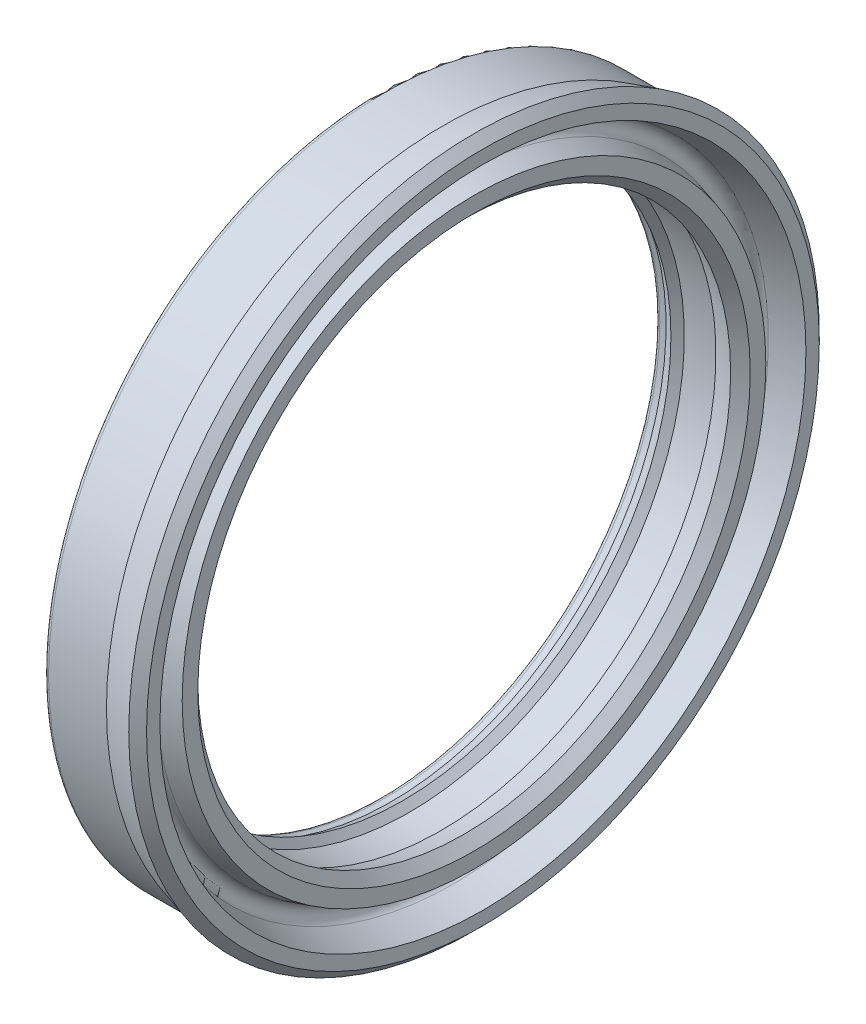
ISO-10303-21;
HEADER;
FILE_DESCRIPTION(('STEP AP214'),'2;1');
FILE_NAME('part.step','',(''),(''),'','','');
FILE_SCHEMA(('AUTOMOTIVE_DESIGN { 1 0 10303 214 1 1 1 1 }'));
ENDSEC;
DATA;
#1=APPLICATION_CONTEXT('core data for automotive mechanical design processes');
#2=APPLICATION_PROTOCOL_DEFINITION('international standard','automotive_design',2000,#1);
#3=PRODUCT_CONTEXT('',#1,'mechanical');
#4=PRODUCT('Part','Part','',(#3));
#5=PRODUCT_RELATED_PRODUCT_CATEGORY('part','',(#4));
#6=PRODUCT_DEFINITION_FORMATION('','',#4);
#7=PRODUCT_DEFINITION_CONTEXT('part definition',#1,'design');
#8=PRODUCT_DEFINITION('design','',#6,#7);
#9=PRODUCT_DEFINITION_SHAPE('','',#8);
#10=(LENGTH_UNIT() NAMED_UNIT(*) SI_UNIT(.MILLI.,.METRE.));
#11=(NAMED_UNIT(*) PLANE_ANGLE_UNIT() SI_UNIT($,.RADIAN.));
#12=(NAMED_UNIT(*) SI_UNIT($,.STERADIAN.) SOLID_ANGLE_UNIT());
#13=UNCERTAINTY_MEASURE_WITH_UNIT(LENGTH_MEASURE(1.E-05),#10,'distance_accuracy_value','');
#14=(GEOMETRIC_REPRESENTATION_CONTEXT(3) GLOBAL_UNCERTAINTY_ASSIGNED_CONTEXT((#13)) GLOBAL_UNIT_ASSIGNED_CONTEXT((#10,
#11,#12)) REPRESENTATION_CONTEXT('',''));
#15=CARTESIAN_POINT('',(0.,0.,0.));
#16=DIRECTION('',(0.,0.,1.));
#17=DIRECTION('',(1.,0.,0.));
#18=AXIS2_PLACEMENT_3D('',#15,#16,#17);
#19=CARTESIAN_POINT('',(8.22450788943598,0.,0.));
#20=DIRECTION('',(1.,0.,0.));
#21=DIRECTION('',(0.,0.,-1.));
#22=AXIS2_PLACEMENT_3D('',#19,#20,#21);
#23=CONICAL_SURFACE('',#22,35.3113033324695,0.279101585036947);
#24=CARTESIAN_POINT('',(11.5,0.,0.));
#25=DIRECTION('',(-1.,0.,0.));
#26=DIRECTION('',(0.,0.,1.));
#27=AXIS2_PLACEMENT_3D('',#24,#25,#26);
#28=CIRCLE('',#27,36.25);
#29=CARTESIAN_POINT('',(11.5,0.,36.25));
#30=VERTEX_POINT('',#29);
#31=EDGE_CURVE('E57',#30,#30,#28,.T.);
#32=ORIENTED_EDGE('',*,*,#31,.F.);
#33=EDGE_LOOP('',(#32));
#34=FACE_BOUND('',#33,.T.);
#35=CARTESIAN_POINT('',(8.22450788943598,0.,0.));
#36=DIRECTION('',(-1.,0.,0.));
#37=DIRECTION('',(0.,0.,1.));
#38=AXIS2_PLACEMENT_3D('',#35,#36,#37);
#39=CIRCLE('',#38,35.3113033324695);
#40=CARTESIAN_POINT('',(8.22450788943598,0.,35.3113033324695));
#41=VERTEX_POINT('',#40);
#42=EDGE_CURVE('E93',#41,#41,#39,.T.);
#43=ORIENTED_EDGE('',*,*,#42,.T.);
#44=EDGE_LOOP('',(#43));
#45=FACE_BOUND('',#44,.T.);
#46=ADVANCED_FACE('F37',(#34,#45),#23,.F.);
#47=CARTESIAN_POINT('',(11.5,37.75,0.));
#48=DIRECTION('',(-1.,0.,0.));
#49=DIRECTION('',(0.,0.,1.));
#50=AXIS2_PLACEMENT_3D('',#47,#48,#49);
#51=PLANE('',#50);
#52=CARTESIAN_POINT('',(11.5,0.,0.));
#53=DIRECTION('',(-1.,0.,0.));
#54=DIRECTION('',(0.,0.,1.));
#55=AXIS2_PLACEMENT_3D('',#52,#53,#54);
#56=CIRCLE('',#55,37.75);
#57=CARTESIAN_POINT('',(11.5,0.,37.75));
#58=VERTEX_POINT('',#57);
#59=EDGE_CURVE('E60',#58,#58,#56,.T.);
#60=ORIENTED_EDGE('',*,*,#59,.F.);
#61=EDGE_LOOP('',(#60));
#62=FACE_BOUND('',#61,.T.);
#63=ORIENTED_EDGE('',*,*,#31,.T.);
#64=EDGE_LOOP('',(#63));
#65=FACE_BOUND('',#64,.T.);
#66=ADVANCED_FACE('F159',(#62,#65),#51,.F.);
#67=CARTESIAN_POINT('',(11.5,0.,0.));
#68=DIRECTION('',(-1.,0.,0.));
#69=DIRECTION('',(0.,0.,1.));
#70=AXIS2_PLACEMENT_3D('',#67,#68,#69);
#71=CONICAL_SURFACE('',#70,37.75,0.785398163397445);
#72=CARTESIAN_POINT('',(10.5,0.,0.));
#73=DIRECTION('',(-1.,0.,0.));
#74=DIRECTION('',(0.,0.,1.));
#75=AXIS2_PLACEMENT_3D('',#72,#73,#74);
#76=CIRCLE('',#75,38.75);
#77=CARTESIAN_POINT('',(10.5,0.,38.75));
#78=VERTEX_POINT('',#77);
#79=EDGE_CURVE('E63',#78,#78,#76,.T.);
#80=ORIENTED_EDGE('',*,*,#79,.F.);
#81=EDGE_LOOP('',(#80));
#82=FACE_BOUND('',#81,.T.);
#83=ORIENTED_EDGE('',*,*,#59,.T.);
#84=EDGE_LOOP('',(#83));
#85=FACE_BOUND('',#84,.T.);
#86=ADVANCED_FACE('F165',(#82,#85),#71,.T.);
#87=CARTESIAN_POINT('',(10.5,0.,0.));
#88=DIRECTION('',(1.,0.,0.));
#89=DIRECTION('',(0.,0.,-1.));
#90=AXIS2_PLACEMENT_3D('',#87,#88,#89);
#91=CONICAL_SURFACE('',#90,38.75,0.278299659005112);
#92=CARTESIAN_POINT('',(7.,0.,0.));
#93=DIRECTION('',(-1.,0.,0.));
#94=DIRECTION('',(0.,0.,1.));
#95=AXIS2_PLACEMENT_3D('',#92,#93,#94);
#96=CIRCLE('',#95,37.75);
#97=CARTESIAN_POINT('',(7.,0.,37.75));
#98=VERTEX_POINT('',#97);
#99=EDGE_CURVE('E66',#98,#98,#96,.T.);
#100=ORIENTED_EDGE('',*,*,#99,.F.);
#101=EDGE_LOOP('',(#100));
#102=FACE_BOUND('',#101,.T.);
#103=ORIENTED_EDGE('',*,*,#79,.T.);
#104=EDGE_LOOP('',(#103));
#105=FACE_BOUND('',#104,.T.);
#106=ADVANCED_FACE('F230',(#102,#105),#91,.T.);
#107=CARTESIAN_POINT('',(0.,0.,0.));
#108=DIRECTION('',(-1.,0.,0.));
#109=DIRECTION('',(0.,0.,1.));
#110=AXIS2_PLACEMENT_3D('',#107,#108,#109);
#111=CYLINDRICAL_SURFACE('',#110,37.75);
#112=CARTESIAN_POINT('',(0.5,0.,0.));
#113=DIRECTION('',(1.,0.,0.));
#114=DIRECTION('',(0.,0.,-1.));
#115=AXIS2_PLACEMENT_3D('',#112,#113,#114);
#116=CIRCLE('',#115,37.75);
#117=CARTESIAN_POINT('',(0.5,0.,-37.75));
#118=VERTEX_POINT('',#117);
#119=EDGE_CURVE('E10',#118,#118,#116,.T.);
#120=ORIENTED_EDGE('',*,*,#119,.T.);
#121=EDGE_LOOP('',(#120));
#122=FACE_BOUND('',#121,.T.);
#123=ORIENTED_EDGE('',*,*,#99,.T.);
#124=EDGE_LOOP('',(#123));
#125=FACE_BOUND('',#124,.T.);
#126=ADVANCED_FACE('F156',(#122,#125),#111,.T.);
#127=CARTESIAN_POINT('',(0.,30.85,0.));
#128=DIRECTION('',(1.,0.,0.));
#129=DIRECTION('',(0.,0.,-1.));
#130=AXIS2_PLACEMENT_3D('',#127,#128,#129);
#131=PLANE('',#130);
#132=CARTESIAN_POINT('',(0.,0.,0.));
#133=DIRECTION('',(1.,0.,0.));
#134=DIRECTION('',(0.,0.,-1.));
#135=AXIS2_PLACEMENT_3D('',#132,#133,#134);
#136=CIRCLE('',#135,31.35);
#137=CARTESIAN_POINT('',(0.,0.,-31.35));
#138=VERTEX_POINT('',#137);
#139=EDGE_CURVE('E44',#138,#138,#136,.T.);
#140=ORIENTED_EDGE('',*,*,#139,.T.);
#141=EDGE_LOOP('',(#140));
#142=FACE_BOUND('',#141,.T.);
#143=CARTESIAN_POINT('',(0.,0.,0.));
#144=DIRECTION('',(1.,0.,0.));
#145=DIRECTION('',(0.,0.,-1.));
#146=AXIS2_PLACEMENT_3D('',#143,#144,#145);
#147=CIRCLE('',#146,37.25);
#148=CARTESIAN_POINT('',(0.,0.,-37.25));
#149=VERTEX_POINT('',#148);
#150=EDGE_CURVE('E48',#149,#149,#147,.F.);
#151=ORIENTED_EDGE('',*,*,#150,.T.);
#152=EDGE_LOOP('',(#151));
#153=FACE_BOUND('',#152,.T.);
#154=ADVANCED_FACE('F149',(#142,#153),#131,.F.);
#155=CARTESIAN_POINT('',(0.,0.,0.));
#156=DIRECTION('',(-1.,0.,0.));
#157=DIRECTION('',(0.,0.,1.));
#158=AXIS2_PLACEMENT_3D('',#155,#156,#157);
#159=CYLINDRICAL_SURFACE('',#158,30.85);
#160=CARTESIAN_POINT('',(0.5,0.,0.));
#161=DIRECTION('',(1.,0.,0.));
#162=DIRECTION('',(0.,0.,-1.));
#163=AXIS2_PLACEMENT_3D('',#160,#161,#162);
#164=CIRCLE('',#163,30.85);
#165=CARTESIAN_POINT('',(0.5,0.,-30.85));
#166=VERTEX_POINT('',#165);
#167=EDGE_CURVE('E52',#166,#166,#164,.F.);
#168=ORIENTED_EDGE('',*,*,#167,.T.);
#169=EDGE_LOOP('',(#168));
#170=FACE_BOUND('',#169,.T.);
#171=CARTESIAN_POINT('',(1.20096189432335,0.,0.));
#172=DIRECTION('',(-1.,0.,0.));
#173=DIRECTION('',(0.,0.,1.));
#174=AXIS2_PLACEMENT_3D('',#171,#172,#173);
#175=CIRCLE('',#174,30.85);
#176=CARTESIAN_POINT('',(1.20096189432335,0.,30.85));
#177=VERTEX_POINT('',#176);
#178=EDGE_CURVE('E69',#177,#177,#175,.T.);
#179=ORIENTED_EDGE('',*,*,#178,.F.);
#180=EDGE_LOOP('',(#179));
#181=FACE_BOUND('',#180,.T.);
#182=ADVANCED_FACE('F144',(#170,#181),#159,.F.);
#183=CARTESIAN_POINT('',(1.20096189432335,0.,0.));
#184=DIRECTION('',(-1.,0.,0.));
#185=DIRECTION('',(0.,0.,1.));
#186=AXIS2_PLACEMENT_3D('',#183,#184,#185);
#187=CONICAL_SURFACE('',#186,30.85,0.523598775598301);
#188=CARTESIAN_POINT('',(2.5,0.,0.));
#189=DIRECTION('',(-1.,0.,0.));
#190=DIRECTION('',(0.,0.,1.));
#191=AXIS2_PLACEMENT_3D('',#188,#189,#190);
#192=CIRCLE('',#191,30.1);
#193=CARTESIAN_POINT('',(2.5,0.,30.1));
#194=VERTEX_POINT('',#193);
#195=EDGE_CURVE('E72',#194,#194,#192,.T.);
#196=ORIENTED_EDGE('',*,*,#195,.F.);
#197=EDGE_LOOP('',(#196));
#198=FACE_BOUND('',#197,.T.);
#199=ORIENTED_EDGE('',*,*,#178,.T.);
#200=EDGE_LOOP('',(#199));
#201=FACE_BOUND('',#200,.T.);
#202=ADVANCED_FACE('F138',(#198,#201),#187,.F.);
#203=CARTESIAN_POINT('',(2.5,0.,0.));
#204=DIRECTION('',(1.,0.,0.));
#205=DIRECTION('',(0.,0.,-1.));
#206=AXIS2_PLACEMENT_3D('',#203,#204,#205);
#207=CONICAL_SURFACE('',#206,30.1,0.78539816339745);
#208=CARTESIAN_POINT('',(3.25,0.,0.));
#209=DIRECTION('',(-1.,0.,0.));
#210=DIRECTION('',(0.,0.,1.));
#211=AXIS2_PLACEMENT_3D('',#208,#209,#210);
#212=CIRCLE('',#211,30.85);
#213=CARTESIAN_POINT('',(3.25,0.,30.85));
#214=VERTEX_POINT('',#213);
#215=EDGE_CURVE('E75',#214,#214,#212,.T.);
#216=ORIENTED_EDGE('',*,*,#215,.F.);
#217=EDGE_LOOP('',(#216));
#218=FACE_BOUND('',#217,.T.);
#219=ORIENTED_EDGE('',*,*,#195,.T.);
#220=EDGE_LOOP('',(#219));
#221=FACE_BOUND('',#220,.T.);
#222=ADVANCED_FACE('F132',(#218,#221),#207,.F.);
#223=CARTESIAN_POINT('',(0.,0.,0.));
#224=DIRECTION('',(-1.,0.,0.));
#225=DIRECTION('',(0.,0.,1.));
#226=AXIS2_PLACEMENT_3D('',#223,#224,#225);
#227=CYLINDRICAL_SURFACE('',#226,30.85);
#228=CARTESIAN_POINT('',(6.8,0.,0.));
#229=DIRECTION('',(-1.,0.,0.));
#230=DIRECTION('',(0.,0.,1.));
#231=AXIS2_PLACEMENT_3D('',#228,#229,#230);
#232=CIRCLE('',#231,30.85);
#233=CARTESIAN_POINT('',(6.8,0.,30.85));
#234=VERTEX_POINT('',#233);
#235=EDGE_CURVE('E78',#234,#234,#232,.T.);
#236=ORIENTED_EDGE('',*,*,#235,.F.);
#237=EDGE_LOOP('',(#236));
#238=FACE_BOUND('',#237,.T.);
#239=ORIENTED_EDGE('',*,*,#215,.T.);
#240=EDGE_LOOP('',(#239));
#241=FACE_BOUND('',#240,.T.);
#242=ADVANCED_FACE('F126',(#238,#241),#227,.F.);
#243=CARTESIAN_POINT('',(6.8,0.,0.));
#244=DIRECTION('',(-1.,0.,0.));
#245=DIRECTION('',(0.,0.,1.));
#246=AXIS2_PLACEMENT_3D('',#243,#244,#245);
#247=CONICAL_SURFACE('',#246,30.85,0.350314212235402);
#248=CARTESIAN_POINT('',(9.40000000000001,0.,0.));
#249=DIRECTION('',(-1.,0.,0.));
#250=DIRECTION('',(0.,0.,1.));
#251=AXIS2_PLACEMENT_3D('',#248,#249,#250);
#252=CIRCLE('',#251,29.9);
#253=CARTESIAN_POINT('',(9.40000000000001,0.,29.9));
#254=VERTEX_POINT('',#253);
#255=EDGE_CURVE('E81',#254,#254,#252,.T.);
#256=ORIENTED_EDGE('',*,*,#255,.F.);
#257=EDGE_LOOP('',(#256));
#258=FACE_BOUND('',#257,.T.);
#259=ORIENTED_EDGE('',*,*,#235,.T.);
#260=EDGE_LOOP('',(#259));
#261=FACE_BOUND('',#260,.T.);
#262=ADVANCED_FACE('F120',(#258,#261),#247,.F.);
#263=CARTESIAN_POINT('',(9.40000000000001,0.,0.));
#264=DIRECTION('',(1.,0.,0.));
#265=DIRECTION('',(0.,0.,-1.));
#266=AXIS2_PLACEMENT_3D('',#263,#264,#265);
#267=CONICAL_SURFACE('',#266,29.9,0.785398163397454);
#268=CARTESIAN_POINT('',(10.5,0.,0.));
#269=DIRECTION('',(-1.,0.,0.));
#270=DIRECTION('',(0.,0.,1.));
#271=AXIS2_PLACEMENT_3D('',#268,#269,#270);
#272=CIRCLE('',#271,31.);
#273=CARTESIAN_POINT('',(10.5,0.,31.));
#274=VERTEX_POINT('',#273);
#275=EDGE_CURVE('E84',#274,#274,#272,.T.);
#276=ORIENTED_EDGE('',*,*,#275,.F.);
#277=EDGE_LOOP('',(#276));
#278=FACE_BOUND('',#277,.T.);
#279=ORIENTED_EDGE('',*,*,#255,.T.);
#280=EDGE_LOOP('',(#279));
#281=FACE_BOUND('',#280,.T.);
#282=ADVANCED_FACE('F114',(#278,#281),#267,.F.);
#283=CARTESIAN_POINT('',(10.5,32.75,0.));
#284=DIRECTION('',(-1.,0.,0.));
#285=DIRECTION('',(0.,0.,1.));
#286=AXIS2_PLACEMENT_3D('',#283,#284,#285);
#287=PLANE('',#286);
#288=CARTESIAN_POINT('',(10.5,0.,0.));
#289=DIRECTION('',(-1.,0.,0.));
#290=DIRECTION('',(0.,0.,1.));
#291=AXIS2_PLACEMENT_3D('',#288,#289,#290);
#292=CIRCLE('',#291,32.75);
#293=CARTESIAN_POINT('',(10.5,0.,32.75));
#294=VERTEX_POINT('',#293);
#295=EDGE_CURVE('E87',#294,#294,#292,.T.);
#296=ORIENTED_EDGE('',*,*,#295,.F.);
#297=EDGE_LOOP('',(#296));
#298=FACE_BOUND('',#297,.T.);
#299=ORIENTED_EDGE('',*,*,#275,.T.);
#300=EDGE_LOOP('',(#299));
#301=FACE_BOUND('',#300,.T.);
#302=ADVANCED_FACE('F108',(#298,#301),#287,.F.);
#303=CARTESIAN_POINT('',(10.5,0.,0.));
#304=DIRECTION('',(-1.,0.,0.));
#305=DIRECTION('',(0.,0.,1.));
#306=AXIS2_PLACEMENT_3D('',#303,#304,#305);
#307=CONICAL_SURFACE('',#306,32.75,0.273637541164438);
#308=CARTESIAN_POINT('',(8.22976457938772,0.,0.));
#309=DIRECTION('',(-1.,0.,0.));
#310=DIRECTION('',(0.,0.,1.));
#311=AXIS2_PLACEMENT_3D('',#308,#309,#310);
#312=CIRCLE('',#311,33.3872057242347);
#313=CARTESIAN_POINT('',(8.22976457938772,0.,33.3872057242347));
#314=VERTEX_POINT('',#313);
#315=EDGE_CURVE('E90',#314,#314,#312,.T.);
#316=ORIENTED_EDGE('',*,*,#315,.F.);
#317=EDGE_LOOP('',(#316));
#318=FACE_BOUND('',#317,.T.);
#319=ORIENTED_EDGE('',*,*,#295,.T.);
#320=EDGE_LOOP('',(#319));
#321=FACE_BOUND('',#320,.T.);
#322=ADVANCED_FACE('F102',(#318,#321),#307,.T.);
#323=CARTESIAN_POINT('',(8.5,0.,0.));
#324=DIRECTION('',(-1.,0.,0.));
#325=DIRECTION('',(0.,0.,1.));
#326=AXIS2_PLACEMENT_3D('',#323,#324,#325);
#327=TOROIDAL_SURFACE('',#326,34.35,1.00000000000001);
#328=ORIENTED_EDGE('',*,*,#42,.F.);
#329=EDGE_LOOP('',(#328));
#330=FACE_BOUND('',#329,.T.);
#331=ORIENTED_EDGE('',*,*,#315,.T.);
#332=EDGE_LOOP('',(#331));
#333=FACE_BOUND('',#332,.T.);
#334=ADVANCED_FACE('F98',(#330,#333),#327,.F.);
#335=CARTESIAN_POINT('',(0.5,0.,0.));
#336=DIRECTION('',(1.,0.,0.));
#337=DIRECTION('',(0.,0.,-1.));
#338=AXIS2_PLACEMENT_3D('',#335,#336,#337);
#339=TOROIDAL_SURFACE('',#338,31.35,0.5);
#340=ORIENTED_EDGE('',*,*,#139,.F.);
#341=EDGE_LOOP('',(#340));
#342=FACE_BOUND('',#341,.T.);
#343=ORIENTED_EDGE('',*,*,#167,.F.);
#344=EDGE_LOOP('',(#343));
#345=FACE_BOUND('',#344,.T.);
#346=ADVANCED_FACE('F101',(#342,#345),#339,.T.);
#347=CARTESIAN_POINT('',(0.5,0.,0.));
#348=DIRECTION('',(1.,0.,0.));
#349=DIRECTION('',(0.,0.,-1.));
#350=AXIS2_PLACEMENT_3D('',#347,#348,#349);
#351=TOROIDAL_SURFACE('',#350,37.25,0.5);
#352=ORIENTED_EDGE('',*,*,#119,.F.);
#353=EDGE_LOOP('',(#352));
#354=FACE_BOUND('',#353,.T.);
#355=ORIENTED_EDGE('',*,*,#150,.F.);
#356=EDGE_LOOP('',(#355));
#357=FACE_BOUND('',#356,.T.);
#358=ADVANCED_FACE('F39',(#354,#357),#351,.T.);
#359=CLOSED_SHELL('',(#46,#66,#86,#106,#126,#154,#182,#202,#222,#242,#262,#282,#302,#322,#334,
#346,#358));
#360=MANIFOLD_SOLID_BREP('B2',#359);
#361=ADVANCED_BREP_SHAPE_REPRESENTATION('',(#18,#360),#14);
#362=SHAPE_DEFINITION_REPRESENTATION(#9,#361);
ENDSEC;
END-ISO-10303-21;
